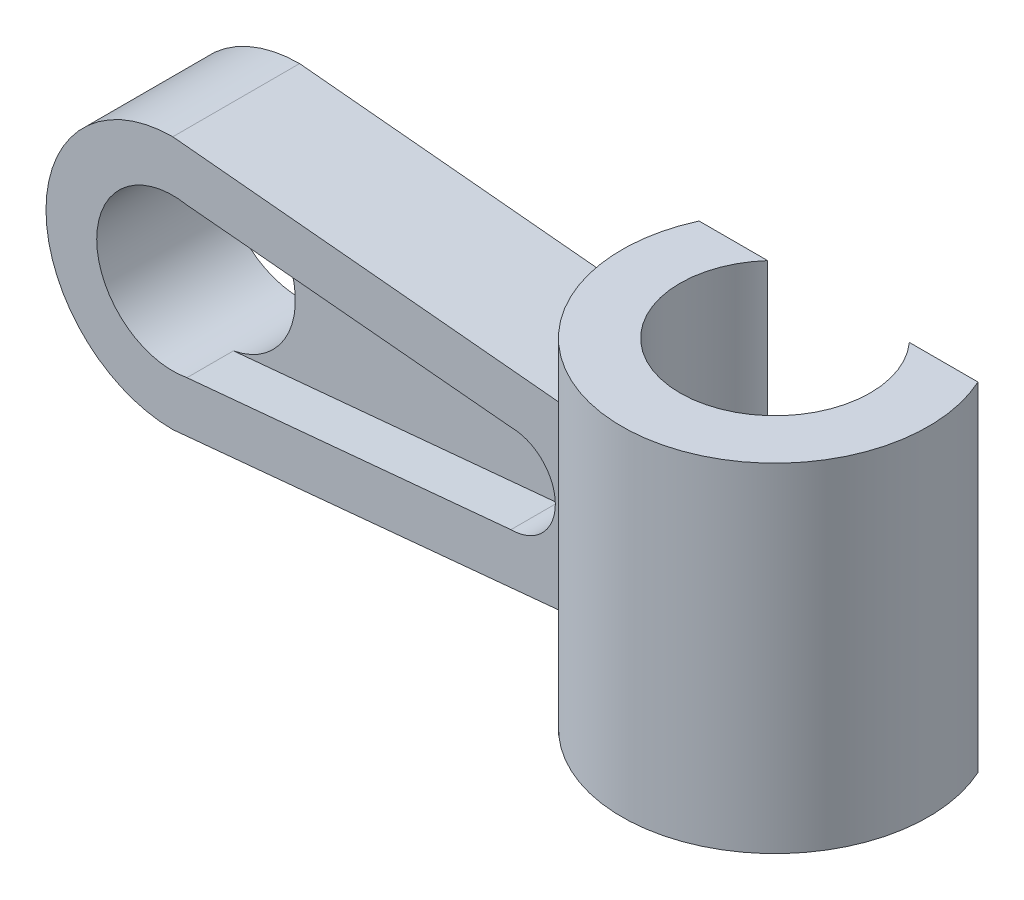
ISO-10303-21;
HEADER;
FILE_DESCRIPTION(('STEP AP214'),'2;1');
FILE_NAME('part.step','',(''),(''),'','','');
FILE_SCHEMA(('AUTOMOTIVE_DESIGN { 1 0 10303 214 1 1 1 1 }'));
ENDSEC;
DATA;
#1=APPLICATION_CONTEXT('core data for automotive mechanical design processes');
#2=APPLICATION_PROTOCOL_DEFINITION('international standard','automotive_design',2000,#1);
#3=PRODUCT_CONTEXT('',#1,'mechanical');
#4=PRODUCT('Part','Part','',(#3));
#5=PRODUCT_RELATED_PRODUCT_CATEGORY('part','',(#4));
#6=PRODUCT_DEFINITION_FORMATION('','',#4);
#7=PRODUCT_DEFINITION_CONTEXT('part definition',#1,'design');
#8=PRODUCT_DEFINITION('design','',#6,#7);
#9=PRODUCT_DEFINITION_SHAPE('','',#8);
#10=(LENGTH_UNIT() NAMED_UNIT(*) SI_UNIT(.MILLI.,.METRE.));
#11=(NAMED_UNIT(*) PLANE_ANGLE_UNIT() SI_UNIT($,.RADIAN.));
#12=(NAMED_UNIT(*) SI_UNIT($,.STERADIAN.) SOLID_ANGLE_UNIT());
#13=UNCERTAINTY_MEASURE_WITH_UNIT(LENGTH_MEASURE(1.E-05),#10,'distance_accuracy_value','');
#14=(GEOMETRIC_REPRESENTATION_CONTEXT(3) GLOBAL_UNCERTAINTY_ASSIGNED_CONTEXT((#13)) GLOBAL_UNIT_ASSIGNED_CONTEXT((#10,
#11,#12)) REPRESENTATION_CONTEXT('',''));
#15=CARTESIAN_POINT('',(0.,0.,0.));
#16=DIRECTION('',(0.,0.,1.));
#17=DIRECTION('',(1.,0.,0.));
#18=AXIS2_PLACEMENT_3D('',#15,#16,#17);
#19=CARTESIAN_POINT('',(25.5,9.,3.));
#20=DIRECTION('',(0.,-1.,0.));
#21=DIRECTION('',(0.,0.,-1.));
#22=AXIS2_PLACEMENT_3D('',#19,#20,#21);
#23=CYLINDRICAL_SURFACE('',#22,7.25);
#24=DIRECTION('',(0.,-1.,0.));
#25=VECTOR('',#24,1.);
#26=CARTESIAN_POINT('',(18.899810608778,9.,0.));
#27=LINE('',#26,#25);
#28=CARTESIAN_POINT('',(18.899810608778,-4.20001803725924,0.));
#29=VERTEX_POINT('',#28);
#30=CARTESIAN_POINT('',(18.899810608778,-7.,0.));
#31=VERTEX_POINT('',#30);
#32=EDGE_CURVE('E286',#29,#31,#27,.T.);
#33=ORIENTED_EDGE('',*,*,#32,.T.);
#34=CARTESIAN_POINT('',(25.5,-7.,3.));
#35=DIRECTION('',(0.,-1.,0.));
#36=DIRECTION('',(0.,0.,-1.));
#37=AXIS2_PLACEMENT_3D('',#34,#35,#36);
#38=CIRCLE('',#37,7.25);
#39=CARTESIAN_POINT('',(32.100189391222,-7.,0.));
#40=VERTEX_POINT('',#39);
#41=EDGE_CURVE('E136',#40,#31,#38,.T.);
#42=ORIENTED_EDGE('',*,*,#41,.F.);
#43=DIRECTION('',(0.,-1.,0.));
#44=VECTOR('',#43,1.);
#45=CARTESIAN_POINT('',(32.100189391222,9.,0.));
#46=LINE('',#45,#44);
#47=CARTESIAN_POINT('',(32.100189391222,9.,0.));
#48=VERTEX_POINT('',#47);
#49=EDGE_CURVE('E122',#40,#48,#46,.F.);
#50=ORIENTED_EDGE('',*,*,#49,.T.);
#51=CARTESIAN_POINT('',(25.5,9.,3.));
#52=DIRECTION('',(0.,-1.,0.));
#53=DIRECTION('',(0.,0.,-1.));
#54=AXIS2_PLACEMENT_3D('',#51,#52,#53);
#55=CIRCLE('',#54,7.25);
#56=CARTESIAN_POINT('',(18.899810608778,9.,0.));
#57=VERTEX_POINT('',#56);
#58=EDGE_CURVE('E134',#48,#57,#55,.T.);
#59=ORIENTED_EDGE('',*,*,#58,.T.);
#60=CARTESIAN_POINT('',(18.899810608778,4.20001803725924,0.));
#61=VERTEX_POINT('',#60);
#62=EDGE_CURVE('E56',#57,#61,#27,.T.);
#63=ORIENTED_EDGE('',*,*,#62,.T.);
#64=CARTESIAN_POINT('',(25.5,3.57142857142857,3.));
#65=DIRECTION('',(-0.0948090926279954,-0.995495472593952,0.));
#66=DIRECTION('',(0.995495472593952,-0.0948090926279954,0.));
#67=AXIS2_PLACEMENT_3D('',#64,#65,#66);
#68=ELLIPSE('',#67,7.28280559740643,7.25);
#69=CARTESIAN_POINT('',(18.899810608778,4.20001803725924,6.));
#70=VERTEX_POINT('',#69);
#71=EDGE_CURVE('E149',#61,#70,#68,.F.);
#72=ORIENTED_EDGE('',*,*,#71,.T.);
#73=DIRECTION('',(0.,-1.,0.));
#74=VECTOR('',#73,1.);
#75=CARTESIAN_POINT('',(18.899810608778,9.,6.));
#76=LINE('',#75,#74);
#77=CARTESIAN_POINT('',(18.899810608778,-4.20001803725924,6.));
#78=VERTEX_POINT('',#77);
#79=EDGE_CURVE('E154',#70,#78,#76,.T.);
#80=ORIENTED_EDGE('',*,*,#79,.T.);
#81=CARTESIAN_POINT('',(25.5,-3.57142857142857,3.));
#82=DIRECTION('',(-0.0948090926279954,0.995495472593952,0.));
#83=DIRECTION('',(-0.995495472593952,-0.0948090926279954,0.));
#84=AXIS2_PLACEMENT_3D('',#81,#82,#83);
#85=ELLIPSE('',#84,7.28280559740643,7.25);
#86=EDGE_CURVE('E151',#78,#29,#85,.F.);
#87=ORIENTED_EDGE('',*,*,#86,.T.);
#88=EDGE_LOOP('',(#33,#42,#50,#59,#63,#72,#80,#87));
#89=FACE_BOUND('',#88,.T.);
#90=ADVANCED_FACE('F33',(#89),#23,.T.);
#91=CARTESIAN_POINT('',(18.25,-7.,3.));
#92=DIRECTION('',(0.,1.,0.));
#93=DIRECTION('',(0.,0.,1.));
#94=AXIS2_PLACEMENT_3D('',#91,#92,#93);
#95=PLANE('',#94);
#96=DIRECTION('',(1.,0.,0.));
#97=VECTOR('',#96,1.);
#98=CARTESIAN_POINT('',(0.,-7.,0.));
#99=LINE('',#98,#97);
#100=CARTESIAN_POINT('',(22.1458980337503,-7.,0.));
#101=VERTEX_POINT('',#100);
#102=EDGE_CURVE('E288',#31,#101,#99,.T.);
#103=ORIENTED_EDGE('',*,*,#102,.T.);
#104=CARTESIAN_POINT('',(25.5,-7.,3.));
#105=DIRECTION('',(0.,-1.,0.));
#106=DIRECTION('',(0.,0.,-1.));
#107=AXIS2_PLACEMENT_3D('',#104,#105,#106);
#108=CIRCLE('',#107,4.5);
#109=CARTESIAN_POINT('',(28.8541019662497,-7.,0.));
#110=VERTEX_POINT('',#109);
#111=EDGE_CURVE('E142',#110,#101,#108,.T.);
#112=ORIENTED_EDGE('',*,*,#111,.F.);
#113=EDGE_CURVE('E137',#110,#40,#99,.T.);
#114=ORIENTED_EDGE('',*,*,#113,.T.);
#115=ORIENTED_EDGE('',*,*,#41,.T.);
#116=EDGE_LOOP('',(#103,#112,#114,#115));
#117=FACE_BOUND('',#116,.T.);
#118=ADVANCED_FACE('F241',(#117),#95,.F.);
#119=CARTESIAN_POINT('',(25.5,9.,3.));
#120=DIRECTION('',(0.,-1.,0.));
#121=DIRECTION('',(0.,0.,-1.));
#122=AXIS2_PLACEMENT_3D('',#119,#120,#121);
#123=CYLINDRICAL_SURFACE('',#122,4.5);
#124=DIRECTION('',(0.,-1.,0.));
#125=VECTOR('',#124,1.);
#126=CARTESIAN_POINT('',(22.1458980337503,9.,0.));
#127=LINE('',#126,#125);
#128=CARTESIAN_POINT('',(22.1458980337503,9.,0.));
#129=VERTEX_POINT('',#128);
#130=EDGE_CURVE('E290',#101,#129,#127,.F.);
#131=ORIENTED_EDGE('',*,*,#130,.T.);
#132=CARTESIAN_POINT('',(25.5,9.,3.));
#133=DIRECTION('',(0.,-1.,0.));
#134=DIRECTION('',(0.,0.,-1.));
#135=AXIS2_PLACEMENT_3D('',#132,#133,#134);
#136=CIRCLE('',#135,4.5);
#137=CARTESIAN_POINT('',(28.8541019662497,9.,0.));
#138=VERTEX_POINT('',#137);
#139=EDGE_CURVE('E140',#138,#129,#136,.T.);
#140=ORIENTED_EDGE('',*,*,#139,.F.);
#141=DIRECTION('',(0.,-1.,0.));
#142=VECTOR('',#141,1.);
#143=CARTESIAN_POINT('',(28.8541019662497,9.,0.));
#144=LINE('',#143,#142);
#145=EDGE_CURVE('E48',#138,#110,#144,.T.);
#146=ORIENTED_EDGE('',*,*,#145,.T.);
#147=ORIENTED_EDGE('',*,*,#111,.T.);
#148=EDGE_LOOP('',(#131,#140,#146,#147));
#149=FACE_BOUND('',#148,.T.);
#150=ADVANCED_FACE('F247',(#149),#123,.F.);
#151=CARTESIAN_POINT('',(18.25,9.,3.));
#152=DIRECTION('',(0.,-1.,0.));
#153=DIRECTION('',(0.,0.,-1.));
#154=AXIS2_PLACEMENT_3D('',#151,#152,#153);
#155=PLANE('',#154);
#156=DIRECTION('',(-1.,0.,0.));
#157=VECTOR('',#156,1.);
#158=CARTESIAN_POINT('',(0.,9.,0.));
#159=LINE('',#158,#157);
#160=EDGE_CURVE('E129',#129,#57,#159,.T.);
#161=ORIENTED_EDGE('',*,*,#160,.T.);
#162=ORIENTED_EDGE('',*,*,#58,.F.);
#163=EDGE_CURVE('E119',#48,#138,#159,.T.);
#164=ORIENTED_EDGE('',*,*,#163,.T.);
#165=ORIENTED_EDGE('',*,*,#139,.T.);
#166=EDGE_LOOP('',(#161,#162,#164,#165));
#167=FACE_BOUND('',#166,.T.);
#168=ADVANCED_FACE('F139',(#167),#155,.F.);
#169=CARTESIAN_POINT('',(21.,-4.,6.));
#170=DIRECTION('',(-0.0948090926279954,0.995495472593952,0.));
#171=DIRECTION('',(-0.995495472593952,-0.0948090926279955,0.));
#172=AXIS2_PLACEMENT_3D('',#169,#170,#171);
#173=PLANE('',#172);
#174=ORIENTED_EDGE('',*,*,#86,.F.);
#175=DIRECTION('',(0.995495472593952,0.0948090926279954,0.));
#176=VECTOR('',#175,1.);
#177=CARTESIAN_POINT('',(21.,-4.,6.));
#178=LINE('',#177,#176);
#179=CARTESIAN_POINT('',(0.,-6.,6.));
#180=VERTEX_POINT('',#179);
#181=EDGE_CURVE('E186',#180,#78,#178,.T.);
#182=ORIENTED_EDGE('',*,*,#181,.F.);
#183=DIRECTION('',(0.,0.,-1.));
#184=VECTOR('',#183,1.);
#185=CARTESIAN_POINT('',(0.,-6.,6.));
#186=LINE('',#185,#184);
#187=CARTESIAN_POINT('',(0.,-6.,0.));
#188=VERTEX_POINT('',#187);
#189=EDGE_CURVE('E201',#180,#188,#186,.T.);
#190=ORIENTED_EDGE('',*,*,#189,.T.);
#191=DIRECTION('',(0.995495472593952,0.0948090926279954,0.));
#192=VECTOR('',#191,1.);
#193=CARTESIAN_POINT('',(21.,-4.,0.));
#194=LINE('',#193,#192);
#195=EDGE_CURVE('E195',#188,#29,#194,.T.);
#196=ORIENTED_EDGE('',*,*,#195,.T.);
#197=EDGE_LOOP('',(#174,#182,#190,#196));
#198=FACE_BOUND('',#197,.T.);
#199=ADVANCED_FACE('F269',(#198),#173,.F.);
#200=CARTESIAN_POINT('',(0.,6.,6.));
#201=DIRECTION('',(-0.0948090926279954,-0.995495472593952,0.));
#202=DIRECTION('',(0.995495472593952,-0.0948090926279955,0.));
#203=AXIS2_PLACEMENT_3D('',#200,#201,#202);
#204=PLANE('',#203);
#205=ORIENTED_EDGE('',*,*,#71,.F.);
#206=DIRECTION('',(-0.995495472593952,0.0948090926279954,0.));
#207=VECTOR('',#206,1.);
#208=CARTESIAN_POINT('',(0.,6.,0.));
#209=LINE('',#208,#207);
#210=CARTESIAN_POINT('',(0.,6.,0.));
#211=VERTEX_POINT('',#210);
#212=EDGE_CURVE('E187',#61,#211,#209,.T.);
#213=ORIENTED_EDGE('',*,*,#212,.T.);
#214=DIRECTION('',(0.,0.,-1.));
#215=VECTOR('',#214,1.);
#216=CARTESIAN_POINT('',(0.,6.,6.));
#217=LINE('',#216,#215);
#218=CARTESIAN_POINT('',(0.,6.,6.));
#219=VERTEX_POINT('',#218);
#220=EDGE_CURVE('E192',#219,#211,#217,.T.);
#221=ORIENTED_EDGE('',*,*,#220,.F.);
#222=DIRECTION('',(-0.995495472593952,0.0948090926279954,0.));
#223=VECTOR('',#222,1.);
#224=CARTESIAN_POINT('',(0.,6.,6.));
#225=LINE('',#224,#223);
#226=EDGE_CURVE('E190',#70,#219,#225,.T.);
#227=ORIENTED_EDGE('',*,*,#226,.F.);
#228=EDGE_LOOP('',(#205,#213,#221,#227));
#229=FACE_BOUND('',#228,.T.);
#230=ADVANCED_FACE('F264',(#229),#204,.F.);
#231=CARTESIAN_POINT('',(0.,0.,6.));
#232=DIRECTION('',(0.,0.,-1.));
#233=DIRECTION('',(-1.,0.,0.));
#234=AXIS2_PLACEMENT_3D('',#231,#232,#233);
#235=PLANE('',#234);
#236=CARTESIAN_POINT('',(0.,0.,6.));
#237=DIRECTION('',(0.,0.,-1.));
#238=DIRECTION('',(-1.,0.,0.));
#239=AXIS2_PLACEMENT_3D('',#236,#237,#238);
#240=CIRCLE('',#239,3.6);
#241=CARTESIAN_POINT('',(0.669119070667952,3.53727008712488,6.));
#242=VERTEX_POINT('',#241);
#243=CARTESIAN_POINT('',(0.669119070667952,-3.53727008712488,6.));
#244=VERTEX_POINT('',#243);
#245=EDGE_CURVE('E179',#242,#244,#240,.F.);
#246=ORIENTED_EDGE('',*,*,#245,.F.);
#247=DIRECTION('',(-0.995634226059288,0.0933407086930582,0.));
#248=VECTOR('',#247,1.);
#249=CARTESIAN_POINT('',(0.,3.6,6.));
#250=LINE('',#249,#248);
#251=CARTESIAN_POINT('',(16.,2.1,6.));
#252=VERTEX_POINT('',#251);
#253=EDGE_CURVE('E160',#252,#242,#250,.T.);
#254=ORIENTED_EDGE('',*,*,#253,.F.);
#255=CARTESIAN_POINT('',(16.,0.,6.));
#256=DIRECTION('',(0.,0.,1.));
#257=DIRECTION('',(1.,0.,0.));
#258=AXIS2_PLACEMENT_3D('',#255,#256,#257);
#259=CIRCLE('',#258,2.1);
#260=CARTESIAN_POINT('',(16.,-2.1,6.));
#261=VERTEX_POINT('',#260);
#262=EDGE_CURVE('E167',#261,#252,#259,.T.);
#263=ORIENTED_EDGE('',*,*,#262,.F.);
#264=DIRECTION('',(0.995634226059288,0.0933407086930582,0.));
#265=VECTOR('',#264,1.);
#266=CARTESIAN_POINT('',(0.,-3.6,6.));
#267=LINE('',#266,#265);
#268=EDGE_CURVE('E156',#244,#261,#267,.T.);
#269=ORIENTED_EDGE('',*,*,#268,.F.);
#270=EDGE_LOOP('',(#246,#254,#263,#269));
#271=FACE_BOUND('',#270,.T.);
#272=ORIENTED_EDGE('',*,*,#79,.F.);
#273=ORIENTED_EDGE('',*,*,#226,.T.);
#274=CARTESIAN_POINT('',(0.,0.,6.));
#275=DIRECTION('',(0.,0.,1.));
#276=DIRECTION('',(-1.,0.,0.));
#277=AXIS2_PLACEMENT_3D('',#274,#275,#276);
#278=CIRCLE('',#277,6.);
#279=EDGE_CURVE('E183',#219,#180,#278,.T.);
#280=ORIENTED_EDGE('',*,*,#279,.T.);
#281=ORIENTED_EDGE('',*,*,#181,.T.);
#282=EDGE_LOOP('',(#272,#273,#280,#281));
#283=FACE_BOUND('',#282,.T.);
#284=ADVANCED_FACE('F217',(#271,#283),#235,.F.);
#285=CARTESIAN_POINT('',(0.,0.,0.));
#286=DIRECTION('',(0.,0.,-1.));
#287=DIRECTION('',(-1.,0.,0.));
#288=AXIS2_PLACEMENT_3D('',#285,#286,#287);
#289=PLANE('',#288);
#290=CARTESIAN_POINT('',(0.,0.,0.));
#291=DIRECTION('',(0.,0.,-1.));
#292=DIRECTION('',(-1.,0.,0.));
#293=AXIS2_PLACEMENT_3D('',#290,#291,#292);
#294=CIRCLE('',#293,3.6);
#295=CARTESIAN_POINT('',(-3.6,0.,0.));
#296=VERTEX_POINT('',#295);
#297=EDGE_CURVE('E174',#296,#296,#294,.T.);
#298=ORIENTED_EDGE('',*,*,#297,.F.);
#299=EDGE_LOOP('',(#298));
#300=FACE_BOUND('',#299,.T.);
#301=ORIENTED_EDGE('',*,*,#212,.F.);
#302=ORIENTED_EDGE('',*,*,#62,.F.);
#303=ORIENTED_EDGE('',*,*,#160,.F.);
#304=ORIENTED_EDGE('',*,*,#130,.F.);
#305=ORIENTED_EDGE('',*,*,#102,.F.);
#306=ORIENTED_EDGE('',*,*,#32,.F.);
#307=ORIENTED_EDGE('',*,*,#195,.F.);
#308=CARTESIAN_POINT('',(0.,0.,0.));
#309=DIRECTION('',(0.,0.,1.));
#310=DIRECTION('',(-1.,0.,0.));
#311=AXIS2_PLACEMENT_3D('',#308,#309,#310);
#312=CIRCLE('',#311,6.);
#313=EDGE_CURVE('E182',#211,#188,#312,.T.);
#314=ORIENTED_EDGE('',*,*,#313,.F.);
#315=EDGE_LOOP('',(#301,#302,#303,#304,#305,#306,#307,#314));
#316=FACE_BOUND('',#315,.T.);
#317=ADVANCED_FACE('F263',(#300,#316),#289,.T.);
#318=CARTESIAN_POINT('',(0.,0.,6.));
#319=DIRECTION('',(0.,0.,-1.));
#320=DIRECTION('',(-1.,0.,0.));
#321=AXIS2_PLACEMENT_3D('',#318,#319,#320);
#322=CYLINDRICAL_SURFACE('',#321,6.);
#323=ORIENTED_EDGE('',*,*,#313,.T.);
#324=ORIENTED_EDGE('',*,*,#189,.F.);
#325=ORIENTED_EDGE('',*,*,#279,.F.);
#326=ORIENTED_EDGE('',*,*,#220,.T.);
#327=EDGE_LOOP('',(#323,#324,#325,#326));
#328=FACE_BOUND('',#327,.T.);
#329=ADVANCED_FACE('F35',(#328),#322,.T.);
#330=CARTESIAN_POINT('',(0.,0.,6.001));
#331=DIRECTION('',(0.,0.,-1.));
#332=DIRECTION('',(-1.,0.,0.));
#333=AXIS2_PLACEMENT_3D('',#330,#331,#332);
#334=CYLINDRICAL_SURFACE('',#333,3.6);
#335=DIRECTION('',(0.,0.,-1.));
#336=VECTOR('',#335,1.);
#337=CARTESIAN_POINT('',(0.669119070667947,3.53727008712488,6.001));
#338=LINE('',#337,#336);
#339=CARTESIAN_POINT('',(0.669119070667952,3.53727008712488,3.8));
#340=VERTEX_POINT('',#339);
#341=EDGE_CURVE('E11',#340,#242,#338,.F.);
#342=ORIENTED_EDGE('',*,*,#341,.T.);
#343=ORIENTED_EDGE('',*,*,#245,.T.);
#344=DIRECTION('',(0.,0.,-1.));
#345=VECTOR('',#344,1.);
#346=CARTESIAN_POINT('',(0.669119070667947,-3.53727008712488,6.001));
#347=LINE('',#346,#345);
#348=CARTESIAN_POINT('',(0.669119070667952,-3.53727008712488,3.8));
#349=VERTEX_POINT('',#348);
#350=EDGE_CURVE('E41',#244,#349,#347,.T.);
#351=ORIENTED_EDGE('',*,*,#350,.T.);
#352=CARTESIAN_POINT('',(0.,0.,3.8));
#353=DIRECTION('',(0.,0.,-1.));
#354=DIRECTION('',(-1.,0.,0.));
#355=AXIS2_PLACEMENT_3D('',#352,#353,#354);
#356=CIRCLE('',#355,3.6);
#357=EDGE_CURVE('E204',#349,#340,#356,.F.);
#358=ORIENTED_EDGE('',*,*,#357,.T.);
#359=EDGE_LOOP('',(#342,#343,#351,#358));
#360=FACE_BOUND('',#359,.T.);
#361=ORIENTED_EDGE('',*,*,#297,.T.);
#362=EDGE_LOOP('',(#361));
#363=FACE_BOUND('',#362,.T.);
#364=ADVANCED_FACE('F208',(#360,#363),#334,.F.);
#365=CARTESIAN_POINT('',(0.,3.6,3.8));
#366=DIRECTION('',(0.0933407086930582,0.995634226059288,0.));
#367=DIRECTION('',(-0.995634226059288,0.0933407086930582,0.));
#368=AXIS2_PLACEMENT_3D('',#365,#366,#367);
#369=PLANE('',#368);
#370=DIRECTION('',(-0.995634226059288,0.0933407086930582,0.));
#371=VECTOR('',#370,1.);
#372=CARTESIAN_POINT('',(0.,3.6,3.8));
#373=LINE('',#372,#371);
#374=CARTESIAN_POINT('',(16.,2.1,3.8));
#375=VERTEX_POINT('',#374);
#376=EDGE_CURVE('E163',#375,#340,#373,.T.);
#377=ORIENTED_EDGE('',*,*,#376,.F.);
#378=DIRECTION('',(0.,0.,1.));
#379=VECTOR('',#378,1.);
#380=CARTESIAN_POINT('',(16.,2.1,3.8));
#381=LINE('',#380,#379);
#382=EDGE_CURVE('E172',#375,#252,#381,.T.);
#383=ORIENTED_EDGE('',*,*,#382,.T.);
#384=ORIENTED_EDGE('',*,*,#253,.T.);
#385=ORIENTED_EDGE('',*,*,#341,.F.);
#386=EDGE_LOOP('',(#377,#383,#384,#385));
#387=FACE_BOUND('',#386,.T.);
#388=ADVANCED_FACE('F228',(#387),#369,.F.);
#389=CARTESIAN_POINT('',(0.,-3.6,3.8));
#390=DIRECTION('',(0.0933407086930582,-0.995634226059288,0.));
#391=DIRECTION('',(0.995634226059288,0.0933407086930582,0.));
#392=AXIS2_PLACEMENT_3D('',#389,#390,#391);
#393=PLANE('',#392);
#394=ORIENTED_EDGE('',*,*,#268,.T.);
#395=DIRECTION('',(0.,0.,1.));
#396=VECTOR('',#395,1.);
#397=CARTESIAN_POINT('',(16.,-2.1,3.8));
#398=LINE('',#397,#396);
#399=CARTESIAN_POINT('',(16.,-2.1,3.8));
#400=VERTEX_POINT('',#399);
#401=EDGE_CURVE('E165',#400,#261,#398,.T.);
#402=ORIENTED_EDGE('',*,*,#401,.F.);
#403=DIRECTION('',(0.995634226059288,0.0933407086930582,0.));
#404=VECTOR('',#403,1.);
#405=CARTESIAN_POINT('',(0.,-3.6,3.8));
#406=LINE('',#405,#404);
#407=EDGE_CURVE('E157',#349,#400,#406,.T.);
#408=ORIENTED_EDGE('',*,*,#407,.F.);
#409=ORIENTED_EDGE('',*,*,#350,.F.);
#410=EDGE_LOOP('',(#394,#402,#408,#409));
#411=FACE_BOUND('',#410,.T.);
#412=ADVANCED_FACE('F213',(#411),#393,.F.);
#413=CARTESIAN_POINT('',(0.,0.,3.8));
#414=DIRECTION('',(0.,0.,-1.));
#415=DIRECTION('',(-1.,0.,0.));
#416=AXIS2_PLACEMENT_3D('',#413,#414,#415);
#417=PLANE('',#416);
#418=ORIENTED_EDGE('',*,*,#407,.T.);
#419=CARTESIAN_POINT('',(16.,0.,3.8));
#420=DIRECTION('',(0.,0.,1.));
#421=DIRECTION('',(1.,0.,0.));
#422=AXIS2_PLACEMENT_3D('',#419,#420,#421);
#423=CIRCLE('',#422,2.1);
#424=EDGE_CURVE('E159',#400,#375,#423,.T.);
#425=ORIENTED_EDGE('',*,*,#424,.T.);
#426=ORIENTED_EDGE('',*,*,#376,.T.);
#427=ORIENTED_EDGE('',*,*,#357,.F.);
#428=EDGE_LOOP('',(#418,#425,#426,#427));
#429=FACE_BOUND('',#428,.T.);
#430=ADVANCED_FACE('F225',(#429),#417,.F.);
#431=CARTESIAN_POINT('',(16.,0.,3.8));
#432=DIRECTION('',(0.,0.,1.));
#433=DIRECTION('',(1.,0.,0.));
#434=AXIS2_PLACEMENT_3D('',#431,#432,#433);
#435=CYLINDRICAL_SURFACE('',#434,2.1);
#436=ORIENTED_EDGE('',*,*,#262,.T.);
#437=ORIENTED_EDGE('',*,*,#382,.F.);
#438=ORIENTED_EDGE('',*,*,#424,.F.);
#439=ORIENTED_EDGE('',*,*,#401,.T.);
#440=EDGE_LOOP('',(#436,#437,#438,#439));
#441=FACE_BOUND('',#440,.T.);
#442=ADVANCED_FACE('F221',(#441),#435,.F.);
#443=CARTESIAN_POINT('',(0.,0.,0.));
#444=DIRECTION('',(0.,0.,-1.));
#445=DIRECTION('',(-1.,0.,0.));
#446=AXIS2_PLACEMENT_3D('',#443,#444,#445);
#447=PLANE('',#446);
#448=ORIENTED_EDGE('',*,*,#113,.F.);
#449=ORIENTED_EDGE('',*,*,#145,.F.);
#450=ORIENTED_EDGE('',*,*,#163,.F.);
#451=ORIENTED_EDGE('',*,*,#49,.F.);
#452=EDGE_LOOP('',(#448,#449,#450,#451));
#453=FACE_BOUND('',#452,.T.);
#454=ADVANCED_FACE('F121',(#453),#447,.T.);
#455=CLOSED_SHELL('',(#90,#118,#150,#168,#199,#230,#284,#317,#329,#364,#388,#412,#430,#442,#454));
#456=MANIFOLD_SOLID_BREP('B2',#455);
#457=ADVANCED_BREP_SHAPE_REPRESENTATION('',(#18,#456),#14);
#458=SHAPE_DEFINITION_REPRESENTATION(#9,#457);
ENDSEC;
END-ISO-10303-21;
